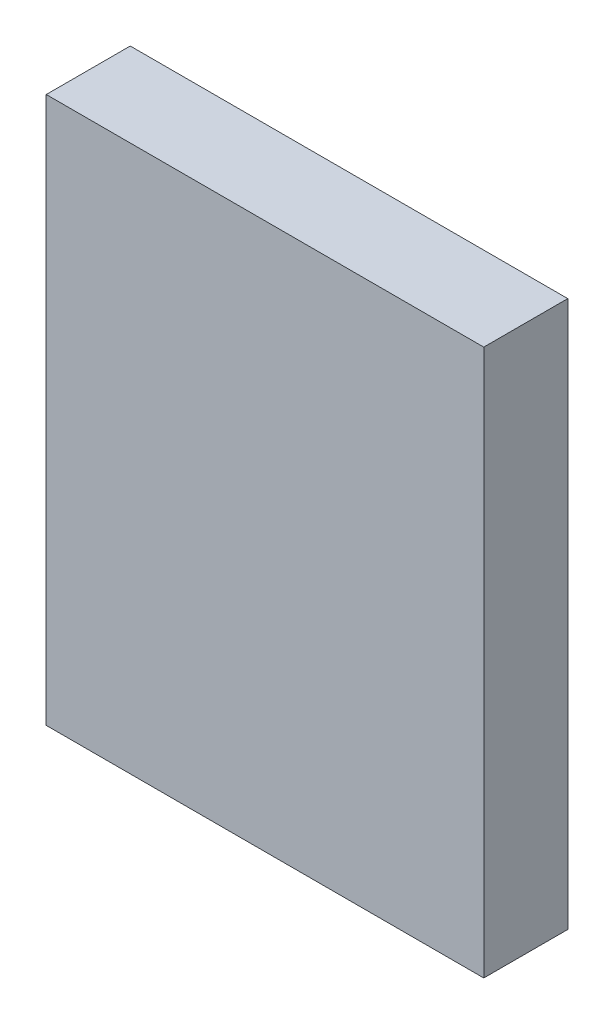
ISO-10303-21;
HEADER;
FILE_DESCRIPTION(('STEP AP214'),'2;1');
FILE_NAME('part.step','',(''),(''),'','','');
FILE_SCHEMA(('AUTOMOTIVE_DESIGN { 1 0 10303 214 1 1 1 1 }'));
ENDSEC;
DATA;
#1=APPLICATION_CONTEXT('core data for automotive mechanical design processes');
#2=APPLICATION_PROTOCOL_DEFINITION('international standard','automotive_design',2000,#1);
#3=PRODUCT_CONTEXT('',#1,'mechanical');
#4=PRODUCT('Part','Part','',(#3));
#5=PRODUCT_RELATED_PRODUCT_CATEGORY('part','',(#4));
#6=PRODUCT_DEFINITION_FORMATION('','',#4);
#7=PRODUCT_DEFINITION_CONTEXT('part definition',#1,'design');
#8=PRODUCT_DEFINITION('design','',#6,#7);
#9=PRODUCT_DEFINITION_SHAPE('','',#8);
#10=(LENGTH_UNIT() NAMED_UNIT(*) SI_UNIT(.MILLI.,.METRE.));
#11=(NAMED_UNIT(*) PLANE_ANGLE_UNIT() SI_UNIT($,.RADIAN.));
#12=(NAMED_UNIT(*) SI_UNIT($,.STERADIAN.) SOLID_ANGLE_UNIT());
#13=UNCERTAINTY_MEASURE_WITH_UNIT(LENGTH_MEASURE(1.E-05),#10,'distance_accuracy_value','');
#14=(GEOMETRIC_REPRESENTATION_CONTEXT(3) GLOBAL_UNCERTAINTY_ASSIGNED_CONTEXT((#13)) GLOBAL_UNIT_ASSIGNED_CONTEXT((#10,
#11,#12)) REPRESENTATION_CONTEXT('',''));
#15=CARTESIAN_POINT('',(0.,0.,0.));
#16=DIRECTION('',(0.,0.,1.));
#17=DIRECTION('',(1.,0.,0.));
#18=AXIS2_PLACEMENT_3D('',#15,#16,#17);
#19=CARTESIAN_POINT('',(-369.220941985373,-88.0826149645177,-1970.637495));
#20=DIRECTION('',(1.,0.,0.));
#21=DIRECTION('',(0.,0.,-1.));
#22=AXIS2_PLACEMENT_3D('',#19,#20,#21);
#23=PLANE('',#22);
#24=DIRECTION('',(0.,-1.,0.));
#25=VECTOR('',#24,1.);
#26=CARTESIAN_POINT('',(-369.220941985373,-88.0826149645177,-1973.812495));
#27=LINE('',#26,#25);
#28=CARTESIAN_POINT('',(-369.220941985373,-67.432346975612,-1973.812495));
#29=VERTEX_POINT('',#28);
#30=CARTESIAN_POINT('',(-369.220941985373,-88.0826149645177,-1973.812495));
#31=VERTEX_POINT('',#30);
#32=EDGE_CURVE('E104',#29,#31,#27,.T.);
#33=ORIENTED_EDGE('',*,*,#32,.T.);
#34=DIRECTION('',(0.,0.,-1.));
#35=VECTOR('',#34,1.);
#36=CARTESIAN_POINT('',(-369.220941985373,-88.0826149645177,-1970.637495));
#37=LINE('',#36,#35);
#38=CARTESIAN_POINT('',(-369.220941985373,-88.0826149645177,-1970.637495));
#39=VERTEX_POINT('',#38);
#40=EDGE_CURVE('E11',#39,#31,#37,.T.);
#41=ORIENTED_EDGE('',*,*,#40,.F.);
#42=DIRECTION('',(0.,-1.,0.));
#43=VECTOR('',#42,1.);
#44=CARTESIAN_POINT('',(-369.220941985373,-88.0826149645177,-1970.637495));
#45=LINE('',#44,#43);
#46=CARTESIAN_POINT('',(-369.220941985373,-67.432346975612,-1970.637495));
#47=VERTEX_POINT('',#46);
#48=EDGE_CURVE('E92',#47,#39,#45,.T.);
#49=ORIENTED_EDGE('',*,*,#48,.F.);
#50=DIRECTION('',(0.,0.,-1.));
#51=VECTOR('',#50,1.);
#52=CARTESIAN_POINT('',(-369.220941985373,-67.432346975612,-1970.637495));
#53=LINE('',#52,#51);
#54=EDGE_CURVE('E100',#47,#29,#53,.T.);
#55=ORIENTED_EDGE('',*,*,#54,.T.);
#56=EDGE_LOOP('',(#33,#41,#49,#55));
#57=FACE_BOUND('',#56,.T.);
#58=ADVANCED_FACE('F41',(#57),#23,.F.);
#59=CARTESIAN_POINT('',(-369.220941985373,-88.0826149645177,-1970.637495));
#60=DIRECTION('',(0.,1.,0.));
#61=DIRECTION('',(0.,0.,1.));
#62=AXIS2_PLACEMENT_3D('',#59,#60,#61);
#63=PLANE('',#62);
#64=DIRECTION('',(1.,0.,0.));
#65=VECTOR('',#64,1.);
#66=CARTESIAN_POINT('',(-369.220941985373,-88.0826149645177,-1973.812495));
#67=LINE('',#66,#65);
#68=CARTESIAN_POINT('',(-352.684933466012,-88.0826149645177,-1973.812495));
#69=VERTEX_POINT('',#68);
#70=EDGE_CURVE('E96',#31,#69,#67,.T.);
#71=ORIENTED_EDGE('',*,*,#70,.T.);
#72=DIRECTION('',(0.,0.,-1.));
#73=VECTOR('',#72,1.);
#74=CARTESIAN_POINT('',(-352.684933466012,-88.0826149645177,-1970.637495));
#75=LINE('',#74,#73);
#76=CARTESIAN_POINT('',(-352.684933466012,-88.0826149645177,-1970.637495));
#77=VERTEX_POINT('',#76);
#78=EDGE_CURVE('E49',#77,#69,#75,.T.);
#79=ORIENTED_EDGE('',*,*,#78,.F.);
#80=DIRECTION('',(1.,0.,0.));
#81=VECTOR('',#80,1.);
#82=CARTESIAN_POINT('',(-369.220941985373,-88.0826149645177,-1970.637495));
#83=LINE('',#82,#81);
#84=EDGE_CURVE('E87',#39,#77,#83,.T.);
#85=ORIENTED_EDGE('',*,*,#84,.F.);
#86=ORIENTED_EDGE('',*,*,#40,.T.);
#87=EDGE_LOOP('',(#71,#79,#85,#86));
#88=FACE_BOUND('',#87,.T.);
#89=ADVANCED_FACE('F95',(#88),#63,.F.);
#90=CARTESIAN_POINT('',(-352.684933466012,-88.0826149645177,-1970.637495));
#91=DIRECTION('',(-1.,0.,0.));
#92=DIRECTION('',(0.,0.,1.));
#93=AXIS2_PLACEMENT_3D('',#90,#91,#92);
#94=PLANE('',#93);
#95=DIRECTION('',(0.,1.,0.));
#96=VECTOR('',#95,1.);
#97=CARTESIAN_POINT('',(-352.684933466012,-88.0826149645177,-1973.812495));
#98=LINE('',#97,#96);
#99=CARTESIAN_POINT('',(-352.684933466012,-67.432346975612,-1973.812495));
#100=VERTEX_POINT('',#99);
#101=EDGE_CURVE('E74',#69,#100,#98,.T.);
#102=ORIENTED_EDGE('',*,*,#101,.T.);
#103=DIRECTION('',(0.,0.,-1.));
#104=VECTOR('',#103,1.);
#105=CARTESIAN_POINT('',(-352.684933466012,-67.432346975612,-1970.637495));
#106=LINE('',#105,#104);
#107=CARTESIAN_POINT('',(-352.684933466012,-67.432346975612,-1970.637495));
#108=VERTEX_POINT('',#107);
#109=EDGE_CURVE('E97',#108,#100,#106,.T.);
#110=ORIENTED_EDGE('',*,*,#109,.F.);
#111=DIRECTION('',(0.,1.,0.));
#112=VECTOR('',#111,1.);
#113=CARTESIAN_POINT('',(-352.684933466012,-88.0826149645177,-1970.637495));
#114=LINE('',#113,#112);
#115=EDGE_CURVE('E90',#77,#108,#114,.T.);
#116=ORIENTED_EDGE('',*,*,#115,.F.);
#117=ORIENTED_EDGE('',*,*,#78,.T.);
#118=EDGE_LOOP('',(#102,#110,#116,#117));
#119=FACE_BOUND('',#118,.T.);
#120=ADVANCED_FACE('F98',(#119),#94,.F.);
#121=CARTESIAN_POINT('',(-369.220941985373,-67.432346975612,-1970.637495));
#122=DIRECTION('',(0.,-1.,0.));
#123=DIRECTION('',(0.,0.,-1.));
#124=AXIS2_PLACEMENT_3D('',#121,#122,#123);
#125=PLANE('',#124);
#126=DIRECTION('',(-1.,0.,0.));
#127=VECTOR('',#126,1.);
#128=CARTESIAN_POINT('',(-369.220941985373,-67.432346975612,-1973.812495));
#129=LINE('',#128,#127);
#130=EDGE_CURVE('E80',#100,#29,#129,.T.);
#131=ORIENTED_EDGE('',*,*,#130,.T.);
#132=ORIENTED_EDGE('',*,*,#54,.F.);
#133=DIRECTION('',(-1.,0.,0.));
#134=VECTOR('',#133,1.);
#135=CARTESIAN_POINT('',(-369.220941985373,-67.432346975612,-1970.637495));
#136=LINE('',#135,#134);
#137=EDGE_CURVE('E57',#108,#47,#136,.T.);
#138=ORIENTED_EDGE('',*,*,#137,.F.);
#139=ORIENTED_EDGE('',*,*,#109,.T.);
#140=EDGE_LOOP('',(#131,#132,#138,#139));
#141=FACE_BOUND('',#140,.T.);
#142=ADVANCED_FACE('F111',(#141),#125,.F.);
#143=CARTESIAN_POINT('',(0.,0.,-1970.637495));
#144=DIRECTION('',(0.,0.,-1.));
#145=DIRECTION('',(-1.,0.,0.));
#146=AXIS2_PLACEMENT_3D('',#143,#144,#145);
#147=PLANE('',#146);
#148=ORIENTED_EDGE('',*,*,#48,.T.);
#149=ORIENTED_EDGE('',*,*,#84,.T.);
#150=ORIENTED_EDGE('',*,*,#115,.T.);
#151=ORIENTED_EDGE('',*,*,#137,.T.);
#152=EDGE_LOOP('',(#148,#149,#150,#151));
#153=FACE_BOUND('',#152,.T.);
#154=ADVANCED_FACE('F88',(#153),#147,.F.);
#155=CARTESIAN_POINT('',(0.,0.,-1973.812495));
#156=DIRECTION('',(0.,0.,-1.));
#157=DIRECTION('',(-1.,0.,0.));
#158=AXIS2_PLACEMENT_3D('',#155,#156,#157);
#159=PLANE('',#158);
#160=ORIENTED_EDGE('',*,*,#32,.F.);
#161=ORIENTED_EDGE('',*,*,#130,.F.);
#162=ORIENTED_EDGE('',*,*,#101,.F.);
#163=ORIENTED_EDGE('',*,*,#70,.F.);
#164=EDGE_LOOP('',(#160,#161,#162,#163));
#165=FACE_BOUND('',#164,.T.);
#166=ADVANCED_FACE('F114',(#165),#159,.T.);
#167=CLOSED_SHELL('',(#58,#89,#120,#142,#154,#166));
#168=MANIFOLD_SOLID_BREP('B2',#167);
#169=ADVANCED_BREP_SHAPE_REPRESENTATION('',(#18,#168),#14);
#170=SHAPE_DEFINITION_REPRESENTATION(#9,#169);
ENDSEC;
END-ISO-10303-21;
